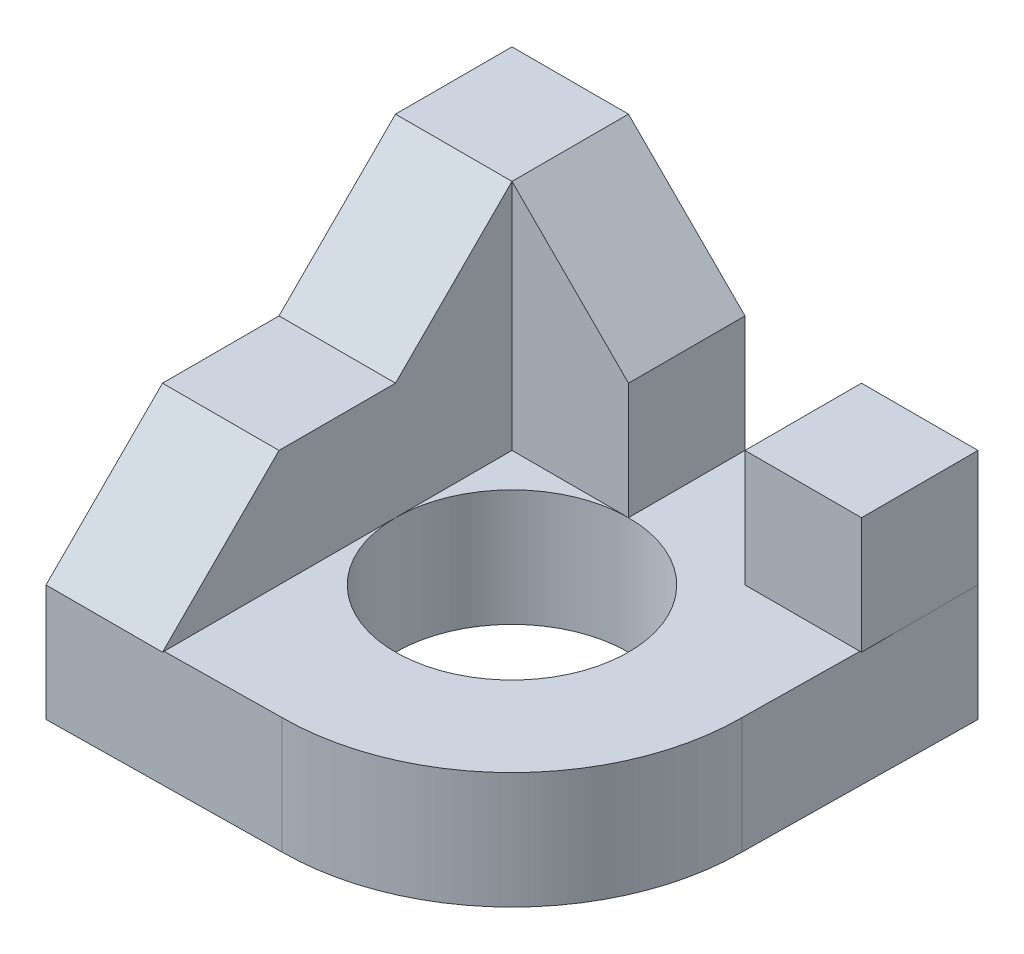
ISO-10303-21;
HEADER;
FILE_DESCRIPTION(('STEP AP214'),'2;1');
FILE_NAME('part.step','',(''),(''),'','','');
FILE_SCHEMA(('AUTOMOTIVE_DESIGN { 1 0 10303 214 1 1 1 1 }'));
ENDSEC;
DATA;
#1=APPLICATION_CONTEXT('core data for automotive mechanical design processes');
#2=APPLICATION_PROTOCOL_DEFINITION('international standard','automotive_design',2000,#1);
#3=PRODUCT_CONTEXT('',#1,'mechanical');
#4=PRODUCT('Part','Part','',(#3));
#5=PRODUCT_RELATED_PRODUCT_CATEGORY('part','',(#4));
#6=PRODUCT_DEFINITION_FORMATION('','',#4);
#7=PRODUCT_DEFINITION_CONTEXT('part definition',#1,'design');
#8=PRODUCT_DEFINITION('design','',#6,#7);
#9=PRODUCT_DEFINITION_SHAPE('','',#8);
#10=(LENGTH_UNIT() NAMED_UNIT(*) SI_UNIT(.MILLI.,.METRE.));
#11=(NAMED_UNIT(*) PLANE_ANGLE_UNIT() SI_UNIT($,.RADIAN.));
#12=(NAMED_UNIT(*) SI_UNIT($,.STERADIAN.) SOLID_ANGLE_UNIT());
#13=UNCERTAINTY_MEASURE_WITH_UNIT(LENGTH_MEASURE(1.E-05),#10,'distance_accuracy_value','');
#14=(GEOMETRIC_REPRESENTATION_CONTEXT(3) GLOBAL_UNCERTAINTY_ASSIGNED_CONTEXT((#13)) GLOBAL_UNIT_ASSIGNED_CONTEXT((#10,
#11,#12)) REPRESENTATION_CONTEXT('',''));
#15=CARTESIAN_POINT('',(0.,0.,0.));
#16=DIRECTION('',(0.,0.,1.));
#17=DIRECTION('',(1.,0.,0.));
#18=AXIS2_PLACEMENT_3D('',#15,#16,#17);
#19=CARTESIAN_POINT('',(-7.98479087452472,10.,-1.29277566539925));
#20=DIRECTION('',(0.,1.,0.));
#21=DIRECTION('',(0.,0.,1.));
#22=AXIS2_PLACEMENT_3D('',#19,#20,#21);
#23=PLANE('',#22);
#24=DIRECTION('',(0.,0.,-1.));
#25=VECTOR('',#24,1.);
#26=CARTESIAN_POINT('',(2.01520912547528,10.,-11.2927756653992));
#27=LINE('',#26,#25);
#28=CARTESIAN_POINT('',(2.01520912547528,10.,-11.2927756653992));
#29=VERTEX_POINT('',#28);
#30=CARTESIAN_POINT('',(2.01520912547528,10.,-21.2927756653992));
#31=VERTEX_POINT('',#30);
#32=EDGE_CURVE('E62',#29,#31,#27,.T.);
#33=ORIENTED_EDGE('',*,*,#32,.T.);
#34=DIRECTION('',(-1.,0.,0.));
#35=VECTOR('',#34,1.);
#36=CARTESIAN_POINT('',(-27.9847908745247,10.,-21.2927756653992));
#37=LINE('',#36,#35);
#38=CARTESIAN_POINT('',(-7.98479087452472,10.,-21.2927756653992));
#39=VERTEX_POINT('',#38);
#40=EDGE_CURVE('E301',#31,#39,#37,.T.);
#41=ORIENTED_EDGE('',*,*,#40,.T.);
#42=DIRECTION('',(0.,0.,-1.));
#43=VECTOR('',#42,1.);
#44=CARTESIAN_POINT('',(-7.98479087452472,10.,-11.2927756653992));
#45=LINE('',#44,#43);
#46=CARTESIAN_POINT('',(-7.98479087452472,10.,-11.2927756653992));
#47=VERTEX_POINT('',#46);
#48=EDGE_CURVE('E235',#47,#39,#45,.T.);
#49=ORIENTED_EDGE('',*,*,#48,.F.);
#50=CARTESIAN_POINT('',(-7.98479087452472,10.,-1.29277566539925));
#51=DIRECTION('',(0.,1.,0.));
#52=DIRECTION('',(0.,0.,1.));
#53=AXIS2_PLACEMENT_3D('',#50,#51,#52);
#54=CIRCLE('',#53,10.);
#55=CARTESIAN_POINT('',(-17.9847908745247,10.,-1.29277566539925));
#56=VERTEX_POINT('',#55);
#57=EDGE_CURVE('E292',#56,#47,#54,.T.);
#58=ORIENTED_EDGE('',*,*,#57,.F.);
#59=DIRECTION('',(0.,0.,1.));
#60=VECTOR('',#59,1.);
#61=CARTESIAN_POINT('',(-17.9847908745247,10.,-21.2927756653992));
#62=LINE('',#61,#60);
#63=CARTESIAN_POINT('',(-17.9847908745247,10.,18.5716349549008));
#64=VERTEX_POINT('',#63);
#65=EDGE_CURVE('E11',#56,#64,#62,.T.);
#66=ORIENTED_EDGE('',*,*,#65,.T.);
#67=DIRECTION('',(0.999908090273213,0.,-0.0135576917717117));
#68=VECTOR('',#67,1.);
#69=CARTESIAN_POINT('',(-27.9847908745247,10.,18.7072243346008));
#70=LINE('',#69,#68);
#71=CARTESIAN_POINT('',(-7.98479087452472,10.,18.4360455752008));
#72=VERTEX_POINT('',#71);
#73=EDGE_CURVE('E304',#64,#72,#70,.T.);
#74=ORIENTED_EDGE('',*,*,#73,.T.);
#75=CARTESIAN_POINT('',(-7.98479087452472,10.,-1.29277566539925));
#76=DIRECTION('',(0.,1.,0.));
#77=DIRECTION('',(0.,0.,1.));
#78=AXIS2_PLACEMENT_3D('',#75,#76,#77);
#79=CIRCLE('',#78,19.7288212406001);
#80=CARTESIAN_POINT('',(11.7440303660754,10.,-1.29277566539924));
#81=VERTEX_POINT('',#80);
#82=EDGE_CURVE('E310',#72,#81,#79,.T.);
#83=ORIENTED_EDGE('',*,*,#82,.T.);
#84=DIRECTION('',(0.0135576917717117,0.,-0.999908090273213));
#85=VECTOR('',#84,1.);
#86=CARTESIAN_POINT('',(12.0152091254753,10.,-21.2927756653992));
#87=LINE('',#86,#85);
#88=CARTESIAN_POINT('',(11.8796197457753,10.,-11.2927756653992));
#89=VERTEX_POINT('',#88);
#90=EDGE_CURVE('E313',#81,#89,#87,.T.);
#91=ORIENTED_EDGE('',*,*,#90,.T.);
#92=DIRECTION('',(-1.,0.,0.));
#93=VECTOR('',#92,1.);
#94=CARTESIAN_POINT('',(12.0152091254753,10.,-11.2927756653992));
#95=LINE('',#94,#93);
#96=EDGE_CURVE('E58',#89,#29,#95,.T.);
#97=ORIENTED_EDGE('',*,*,#96,.T.);
#98=EDGE_LOOP('',(#33,#41,#49,#58,#66,#74,#83,#91,#97));
#99=FACE_BOUND('',#98,.T.);
#100=ADVANCED_FACE('F39',(#99),#23,.T.);
#101=DIRECTION('',(-1.,0.,0.));
#102=VECTOR('',#101,1.);
#103=CARTESIAN_POINT('',(-17.9847908745247,10.,-11.2927756653992));
#104=LINE('',#103,#102);
#105=CARTESIAN_POINT('',(-17.9847908745247,10.,-11.2927756653992));
#106=VERTEX_POINT('',#105);
#107=EDGE_CURVE('E220',#47,#106,#104,.T.);
#108=ORIENTED_EDGE('',*,*,#107,.T.);
#109=EDGE_CURVE('E50',#106,#56,#62,.T.);
#110=ORIENTED_EDGE('',*,*,#109,.T.);
#111=EDGE_CURVE('E297',#47,#56,#54,.T.);
#112=ORIENTED_EDGE('',*,*,#111,.F.);
#113=EDGE_LOOP('',(#108,#110,#112));
#114=FACE_BOUND('',#113,.T.);
#115=ADVANCED_FACE('F405',(#114),#23,.T.);
#116=CARTESIAN_POINT('',(-7.98479087452472,0.,-1.29277566539925));
#117=DIRECTION('',(0.,1.,0.));
#118=DIRECTION('',(0.,0.,1.));
#119=AXIS2_PLACEMENT_3D('',#116,#117,#118);
#120=PLANE('',#119);
#121=DIRECTION('',(-1.,0.,0.));
#122=VECTOR('',#121,1.);
#123=CARTESIAN_POINT('',(-27.9847908745247,0.,-21.2927756653992));
#124=LINE('',#123,#122);
#125=CARTESIAN_POINT('',(12.0152091254753,0.,-21.2927756653992));
#126=VERTEX_POINT('',#125);
#127=CARTESIAN_POINT('',(-27.9847908745247,0.,-21.2927756653992));
#128=VERTEX_POINT('',#127);
#129=EDGE_CURVE('E296',#126,#128,#124,.T.);
#130=ORIENTED_EDGE('',*,*,#129,.F.);
#131=DIRECTION('',(0.0135576917717117,0.,-0.999908090273213));
#132=VECTOR('',#131,1.);
#133=CARTESIAN_POINT('',(12.0152091254753,0.,-21.2927756653992));
#134=LINE('',#133,#132);
#135=CARTESIAN_POINT('',(11.7440303660754,0.,-1.29277566539924));
#136=VERTEX_POINT('',#135);
#137=EDGE_CURVE('E305',#136,#126,#134,.T.);
#138=ORIENTED_EDGE('',*,*,#137,.F.);
#139=CARTESIAN_POINT('',(-7.98479087452472,0.,-1.29277566539925));
#140=DIRECTION('',(0.,1.,0.));
#141=DIRECTION('',(0.,0.,1.));
#142=AXIS2_PLACEMENT_3D('',#139,#140,#141);
#143=CIRCLE('',#142,19.7288212406001);
#144=CARTESIAN_POINT('',(-7.98479087452472,0.,18.4360455752008));
#145=VERTEX_POINT('',#144);
#146=EDGE_CURVE('E326',#145,#136,#143,.T.);
#147=ORIENTED_EDGE('',*,*,#146,.F.);
#148=DIRECTION('',(0.999908090273213,0.,-0.0135576917717117));
#149=VECTOR('',#148,1.);
#150=CARTESIAN_POINT('',(-27.9847908745247,0.,18.7072243346008));
#151=LINE('',#150,#149);
#152=CARTESIAN_POINT('',(-27.9847908745247,0.,18.7072243346008));
#153=VERTEX_POINT('',#152);
#154=EDGE_CURVE('E323',#153,#145,#151,.T.);
#155=ORIENTED_EDGE('',*,*,#154,.F.);
#156=DIRECTION('',(0.,0.,1.));
#157=VECTOR('',#156,1.);
#158=CARTESIAN_POINT('',(-27.9847908745247,0.,-21.2927756653992));
#159=LINE('',#158,#157);
#160=EDGE_CURVE('E320',#128,#153,#159,.T.);
#161=ORIENTED_EDGE('',*,*,#160,.F.);
#162=EDGE_LOOP('',(#130,#138,#147,#155,#161));
#163=FACE_BOUND('',#162,.T.);
#164=CARTESIAN_POINT('',(-7.98479087452472,0.,-1.29277566539925));
#165=DIRECTION('',(0.,1.,0.));
#166=DIRECTION('',(0.,0.,1.));
#167=AXIS2_PLACEMENT_3D('',#164,#165,#166);
#168=CIRCLE('',#167,10.);
#169=CARTESIAN_POINT('',(-7.98479087452472,0.,8.70722433460075));
#170=VERTEX_POINT('',#169);
#171=EDGE_CURVE('E279',#170,#170,#168,.T.);
#172=ORIENTED_EDGE('',*,*,#171,.T.);
#173=EDGE_LOOP('',(#172));
#174=FACE_BOUND('',#173,.T.);
#175=ADVANCED_FACE('F358',(#163,#174),#120,.F.);
#176=CARTESIAN_POINT('',(-27.9847908745247,10.,-21.2927756653992));
#177=DIRECTION('',(0.,0.,1.));
#178=DIRECTION('',(1.,0.,0.));
#179=AXIS2_PLACEMENT_3D('',#176,#177,#178);
#180=PLANE('',#179);
#181=ORIENTED_EDGE('',*,*,#129,.T.);
#182=DIRECTION('',(0.,-1.,0.));
#183=VECTOR('',#182,1.);
#184=CARTESIAN_POINT('',(-27.9847908745247,10.,-21.2927756653992));
#185=LINE('',#184,#183);
#186=CARTESIAN_POINT('',(-27.9847908745247,30.,-21.2927756653992));
#187=VERTEX_POINT('',#186);
#188=EDGE_CURVE('E43',#187,#128,#185,.T.);
#189=ORIENTED_EDGE('',*,*,#188,.F.);
#190=DIRECTION('',(-1.,0.,0.));
#191=VECTOR('',#190,1.);
#192=CARTESIAN_POINT('',(-17.9847908745247,30.,-21.2927756653992));
#193=LINE('',#192,#191);
#194=CARTESIAN_POINT('',(-17.9847908745247,30.,-21.2927756653992));
#195=VERTEX_POINT('',#194);
#196=EDGE_CURVE('E283',#195,#187,#193,.T.);
#197=ORIENTED_EDGE('',*,*,#196,.F.);
#198=DIRECTION('',(0.707106781186547,-0.707106781186548,0.));
#199=VECTOR('',#198,1.);
#200=CARTESIAN_POINT('',(-7.98479087452472,20.,-21.2927756653992));
#201=LINE('',#200,#199);
#202=CARTESIAN_POINT('',(-7.98479087452472,20.,-21.2927756653992));
#203=VERTEX_POINT('',#202);
#204=EDGE_CURVE('E205',#195,#203,#201,.T.);
#205=ORIENTED_EDGE('',*,*,#204,.T.);
#206=DIRECTION('',(0.,-1.,0.));
#207=VECTOR('',#206,1.);
#208=CARTESIAN_POINT('',(-7.98479087452472,10.,-21.2927756653992));
#209=LINE('',#208,#207);
#210=EDGE_CURVE('E216',#203,#39,#209,.T.);
#211=ORIENTED_EDGE('',*,*,#210,.T.);
#212=ORIENTED_EDGE('',*,*,#40,.F.);
#213=DIRECTION('',(0.,1.,0.));
#214=VECTOR('',#213,1.);
#215=CARTESIAN_POINT('',(2.01520912547528,10.,-21.2927756653992));
#216=LINE('',#215,#214);
#217=CARTESIAN_POINT('',(2.01520912547528,20.,-21.2927756653992));
#218=VERTEX_POINT('',#217);
#219=EDGE_CURVE('E189',#31,#218,#216,.T.);
#220=ORIENTED_EDGE('',*,*,#219,.T.);
#221=DIRECTION('',(1.,0.,0.));
#222=VECTOR('',#221,1.);
#223=CARTESIAN_POINT('',(12.0152091254753,20.,-21.2927756653992));
#224=LINE('',#223,#222);
#225=CARTESIAN_POINT('',(12.0152091254753,20.,-21.2927756653992));
#226=VERTEX_POINT('',#225);
#227=EDGE_CURVE('E184',#218,#226,#224,.T.);
#228=ORIENTED_EDGE('',*,*,#227,.T.);
#229=DIRECTION('',(0.,-1.,0.));
#230=VECTOR('',#229,1.);
#231=CARTESIAN_POINT('',(12.0152091254753,10.,-21.2927756653992));
#232=LINE('',#231,#230);
#233=CARTESIAN_POINT('',(12.0152091254753,10.,-21.2927756653992));
#234=VERTEX_POINT('',#233);
#235=EDGE_CURVE('E197',#226,#234,#232,.T.);
#236=ORIENTED_EDGE('',*,*,#235,.T.);
#237=DIRECTION('',(0.,-1.,0.));
#238=VECTOR('',#237,1.);
#239=CARTESIAN_POINT('',(12.0152091254753,10.,-21.2927756653992));
#240=LINE('',#239,#238);
#241=EDGE_CURVE('E316',#234,#126,#240,.T.);
#242=ORIENTED_EDGE('',*,*,#241,.T.);
#243=EDGE_LOOP('',(#181,#189,#197,#205,#211,#212,#220,#228,#236,#242));
#244=FACE_BOUND('',#243,.T.);
#245=ADVANCED_FACE('F41',(#244),#180,.F.);
#246=CARTESIAN_POINT('',(-27.9847908745247,10.,-21.2927756653992));
#247=DIRECTION('',(1.,0.,0.));
#248=DIRECTION('',(0.,0.,-1.));
#249=AXIS2_PLACEMENT_3D('',#246,#247,#248);
#250=PLANE('',#249);
#251=ORIENTED_EDGE('',*,*,#160,.T.);
#252=DIRECTION('',(0.,-1.,0.));
#253=VECTOR('',#252,1.);
#254=CARTESIAN_POINT('',(-27.9847908745247,10.,18.7072243346008));
#255=LINE('',#254,#253);
#256=CARTESIAN_POINT('',(-27.9847908745247,10.,18.7072243346008));
#257=VERTEX_POINT('',#256);
#258=EDGE_CURVE('E341',#257,#153,#255,.T.);
#259=ORIENTED_EDGE('',*,*,#258,.F.);
#260=DIRECTION('',(0.,0.707106781186548,-0.707106781186547));
#261=VECTOR('',#260,1.);
#262=CARTESIAN_POINT('',(-27.9847908745247,10.,18.7072243346008));
#263=LINE('',#262,#261);
#264=CARTESIAN_POINT('',(-27.9847908745247,20.,8.70722433460075));
#265=VERTEX_POINT('',#264);
#266=EDGE_CURVE('E247',#257,#265,#263,.T.);
#267=ORIENTED_EDGE('',*,*,#266,.T.);
#268=DIRECTION('',(0.,0.,-1.));
#269=VECTOR('',#268,1.);
#270=CARTESIAN_POINT('',(-27.9847908745247,20.,8.70722433460075));
#271=LINE('',#270,#269);
#272=CARTESIAN_POINT('',(-27.9847908745247,20.,-1.29277566539925));
#273=VERTEX_POINT('',#272);
#274=EDGE_CURVE('E239',#265,#273,#271,.T.);
#275=ORIENTED_EDGE('',*,*,#274,.T.);
#276=DIRECTION('',(0.,0.707106781186547,-0.707106781186548));
#277=VECTOR('',#276,1.);
#278=CARTESIAN_POINT('',(-27.9847908745247,20.,-1.29277566539925));
#279=LINE('',#278,#277);
#280=CARTESIAN_POINT('',(-27.9847908745247,30.,-11.2927756653992));
#281=VERTEX_POINT('',#280);
#282=EDGE_CURVE('E265',#273,#281,#279,.T.);
#283=ORIENTED_EDGE('',*,*,#282,.T.);
#284=DIRECTION('',(0.,0.,-1.));
#285=VECTOR('',#284,1.);
#286=CARTESIAN_POINT('',(-27.9847908745247,30.,-11.2927756653992));
#287=LINE('',#286,#285);
#288=EDGE_CURVE('E269',#281,#187,#287,.T.);
#289=ORIENTED_EDGE('',*,*,#288,.T.);
#290=ORIENTED_EDGE('',*,*,#188,.T.);
#291=EDGE_LOOP('',(#251,#259,#267,#275,#283,#289,#290));
#292=FACE_BOUND('',#291,.T.);
#293=ADVANCED_FACE('F351',(#292),#250,.F.);
#294=CARTESIAN_POINT('',(-27.9847908745247,10.,18.7072243346008));
#295=DIRECTION('',(-0.0135576917717117,0.,-0.999908090273213));
#296=DIRECTION('',(-0.999908090273213,0.,0.0135576917717117));
#297=AXIS2_PLACEMENT_3D('',#294,#295,#296);
#298=PLANE('',#297);
#299=ORIENTED_EDGE('',*,*,#154,.T.);
#300=DIRECTION('',(0.,-1.,0.));
#301=VECTOR('',#300,1.);
#302=CARTESIAN_POINT('',(-7.98479087452472,10.,18.4360455752008));
#303=LINE('',#302,#301);
#304=EDGE_CURVE('E338',#72,#145,#303,.T.);
#305=ORIENTED_EDGE('',*,*,#304,.F.);
#306=ORIENTED_EDGE('',*,*,#73,.F.);
#307=EDGE_CURVE('E306',#257,#64,#70,.T.);
#308=ORIENTED_EDGE('',*,*,#307,.F.);
#309=ORIENTED_EDGE('',*,*,#258,.T.);
#310=EDGE_LOOP('',(#299,#305,#306,#308,#309));
#311=FACE_BOUND('',#310,.T.);
#312=ADVANCED_FACE('F362',(#311),#298,.F.);
#313=CARTESIAN_POINT('',(-7.98479087452472,10.,-1.29277566539925));
#314=DIRECTION('',(0.,-1.,0.));
#315=DIRECTION('',(0.,0.,-1.));
#316=AXIS2_PLACEMENT_3D('',#313,#314,#315);
#317=CYLINDRICAL_SURFACE('',#316,19.7288212406001);
#318=ORIENTED_EDGE('',*,*,#146,.T.);
#319=DIRECTION('',(0.,-1.,0.));
#320=VECTOR('',#319,1.);
#321=CARTESIAN_POINT('',(11.7440303660754,10.,-1.29277566539924));
#322=LINE('',#321,#320);
#323=EDGE_CURVE('E334',#81,#136,#322,.T.);
#324=ORIENTED_EDGE('',*,*,#323,.F.);
#325=ORIENTED_EDGE('',*,*,#82,.F.);
#326=ORIENTED_EDGE('',*,*,#304,.T.);
#327=EDGE_LOOP('',(#318,#324,#325,#326));
#328=FACE_BOUND('',#327,.T.);
#329=ADVANCED_FACE('F366',(#328),#317,.T.);
#330=CARTESIAN_POINT('',(12.0152091254753,10.,-21.2927756653992));
#331=DIRECTION('',(-0.999908090273213,0.,-0.0135576917717117));
#332=DIRECTION('',(-0.0135576917717117,0.,0.999908090273213));
#333=AXIS2_PLACEMENT_3D('',#330,#331,#332);
#334=PLANE('',#333);
#335=ORIENTED_EDGE('',*,*,#137,.T.);
#336=ORIENTED_EDGE('',*,*,#241,.F.);
#337=EDGE_CURVE('E163',#89,#234,#87,.T.);
#338=ORIENTED_EDGE('',*,*,#337,.F.);
#339=ORIENTED_EDGE('',*,*,#90,.F.);
#340=ORIENTED_EDGE('',*,*,#323,.T.);
#341=EDGE_LOOP('',(#335,#336,#338,#339,#340));
#342=FACE_BOUND('',#341,.T.);
#343=ADVANCED_FACE('F410',(#342),#334,.F.);
#344=CARTESIAN_POINT('',(-7.98479087452472,10.,-1.29277566539925));
#345=DIRECTION('',(0.,-1.,0.));
#346=DIRECTION('',(0.,0.,-1.));
#347=AXIS2_PLACEMENT_3D('',#344,#345,#346);
#348=CYLINDRICAL_SURFACE('',#347,10.);
#349=ORIENTED_EDGE('',*,*,#57,.T.);
#350=ORIENTED_EDGE('',*,*,#111,.T.);
#351=EDGE_LOOP('',(#349,#350));
#352=FACE_BOUND('',#351,.T.);
#353=ORIENTED_EDGE('',*,*,#171,.F.);
#354=EDGE_LOOP('',(#353));
#355=FACE_BOUND('',#354,.T.);
#356=ADVANCED_FACE('F407',(#352,#355),#348,.F.);
#357=CARTESIAN_POINT('',(-17.9847908745247,20.,8.70722433460075));
#358=DIRECTION('',(0.,1.,0.));
#359=DIRECTION('',(0.,0.,1.));
#360=AXIS2_PLACEMENT_3D('',#357,#358,#359);
#361=PLANE('',#360);
#362=ORIENTED_EDGE('',*,*,#274,.F.);
#363=DIRECTION('',(-1.,0.,0.));
#364=VECTOR('',#363,1.);
#365=CARTESIAN_POINT('',(-17.9847908745247,20.,8.70722433460075));
#366=LINE('',#365,#364);
#367=CARTESIAN_POINT('',(-17.9847908745247,20.,8.70722433460075));
#368=VERTEX_POINT('',#367);
#369=EDGE_CURVE('E276',#368,#265,#366,.T.);
#370=ORIENTED_EDGE('',*,*,#369,.F.);
#371=DIRECTION('',(0.,0.,-1.));
#372=VECTOR('',#371,1.);
#373=CARTESIAN_POINT('',(-17.9847908745247,20.,8.70722433460075));
#374=LINE('',#373,#372);
#375=CARTESIAN_POINT('',(-17.9847908745247,20.,-1.29277566539925));
#376=VERTEX_POINT('',#375);
#377=EDGE_CURVE('E242',#368,#376,#374,.T.);
#378=ORIENTED_EDGE('',*,*,#377,.T.);
#379=DIRECTION('',(-1.,0.,0.));
#380=VECTOR('',#379,1.);
#381=CARTESIAN_POINT('',(-17.9847908745247,20.,-1.29277566539925));
#382=LINE('',#381,#380);
#383=EDGE_CURVE('E261',#376,#273,#382,.T.);
#384=ORIENTED_EDGE('',*,*,#383,.T.);
#385=EDGE_LOOP('',(#362,#370,#378,#384));
#386=FACE_BOUND('',#385,.T.);
#387=ADVANCED_FACE('F388',(#386),#361,.T.);
#388=CARTESIAN_POINT('',(-17.9847908745247,10.,18.7072243346008));
#389=DIRECTION('',(0.,0.707106781186547,0.707106781186548));
#390=DIRECTION('',(0.,-0.707106781186548,0.707106781186547));
#391=AXIS2_PLACEMENT_3D('',#388,#389,#390);
#392=PLANE('',#391);
#393=ORIENTED_EDGE('',*,*,#266,.F.);
#394=DIRECTION('',(-1.,0.,0.));
#395=VECTOR('',#394,1.);
#396=CARTESIAN_POINT('',(-17.9847908745247,10.,18.7072243346008));
#397=LINE('',#396,#395);
#398=CARTESIAN_POINT('',(-17.9847908745247,10.,18.7072243346008));
#399=VERTEX_POINT('',#398);
#400=EDGE_CURVE('E280',#399,#257,#397,.T.);
#401=ORIENTED_EDGE('',*,*,#400,.F.);
#402=DIRECTION('',(0.,0.707106781186548,-0.707106781186547));
#403=VECTOR('',#402,1.);
#404=CARTESIAN_POINT('',(-17.9847908745247,10.,18.7072243346008));
#405=LINE('',#404,#403);
#406=EDGE_CURVE('E257',#399,#368,#405,.T.);
#407=ORIENTED_EDGE('',*,*,#406,.T.);
#408=ORIENTED_EDGE('',*,*,#369,.T.);
#409=EDGE_LOOP('',(#393,#401,#407,#408));
#410=FACE_BOUND('',#409,.T.);
#411=ADVANCED_FACE('F381',(#410),#392,.T.);
#412=CARTESIAN_POINT('',(-17.9847908745247,10.,-21.2927756653992));
#413=DIRECTION('',(0.,-1.,0.));
#414=DIRECTION('',(0.,0.,-1.));
#415=AXIS2_PLACEMENT_3D('',#412,#413,#414);
#416=PLANE('',#415);
#417=ORIENTED_EDGE('',*,*,#400,.T.);
#418=ORIENTED_EDGE('',*,*,#307,.T.);
#419=EDGE_CURVE('E51',#64,#399,#62,.T.);
#420=ORIENTED_EDGE('',*,*,#419,.T.);
#421=EDGE_LOOP('',(#417,#418,#420));
#422=FACE_BOUND('',#421,.T.);
#423=ADVANCED_FACE('F376',(#422),#416,.T.);
#424=CARTESIAN_POINT('',(-17.9847908745247,30.,-11.2927756653992));
#425=DIRECTION('',(0.,1.,0.));
#426=DIRECTION('',(0.,0.,1.));
#427=AXIS2_PLACEMENT_3D('',#424,#425,#426);
#428=PLANE('',#427);
#429=ORIENTED_EDGE('',*,*,#288,.F.);
#430=DIRECTION('',(-1.,0.,0.));
#431=VECTOR('',#430,1.);
#432=CARTESIAN_POINT('',(-17.9847908745247,30.,-11.2927756653992));
#433=LINE('',#432,#431);
#434=CARTESIAN_POINT('',(-17.9847908745247,30.,-11.2927756653992));
#435=VERTEX_POINT('',#434);
#436=EDGE_CURVE('E287',#435,#281,#433,.T.);
#437=ORIENTED_EDGE('',*,*,#436,.F.);
#438=DIRECTION('',(0.,0.,-1.));
#439=VECTOR('',#438,1.);
#440=CARTESIAN_POINT('',(-17.9847908745247,30.,-11.2927756653992));
#441=LINE('',#440,#439);
#442=EDGE_CURVE('E251',#435,#195,#441,.T.);
#443=ORIENTED_EDGE('',*,*,#442,.T.);
#444=ORIENTED_EDGE('',*,*,#196,.T.);
#445=EDGE_LOOP('',(#429,#437,#443,#444));
#446=FACE_BOUND('',#445,.T.);
#447=ADVANCED_FACE('F394',(#446),#428,.T.);
#448=CARTESIAN_POINT('',(-17.9847908745247,20.,-1.29277566539925));
#449=DIRECTION('',(0.,0.707106781186548,0.707106781186547));
#450=DIRECTION('',(0.,-0.707106781186547,0.707106781186548));
#451=AXIS2_PLACEMENT_3D('',#448,#449,#450);
#452=PLANE('',#451);
#453=ORIENTED_EDGE('',*,*,#282,.F.);
#454=ORIENTED_EDGE('',*,*,#383,.F.);
#455=DIRECTION('',(0.,0.707106781186547,-0.707106781186548));
#456=VECTOR('',#455,1.);
#457=CARTESIAN_POINT('',(-17.9847908745247,20.,-1.29277566539925));
#458=LINE('',#457,#456);
#459=EDGE_CURVE('E246',#376,#435,#458,.T.);
#460=ORIENTED_EDGE('',*,*,#459,.T.);
#461=ORIENTED_EDGE('',*,*,#436,.T.);
#462=EDGE_LOOP('',(#453,#454,#460,#461));
#463=FACE_BOUND('',#462,.T.);
#464=ADVANCED_FACE('F391',(#463),#452,.T.);
#465=CARTESIAN_POINT('',(-17.9847908745247,0.,0.));
#466=DIRECTION('',(-1.,0.,0.));
#467=DIRECTION('',(0.,0.,1.));
#468=AXIS2_PLACEMENT_3D('',#465,#466,#467);
#469=PLANE('',#468);
#470=ORIENTED_EDGE('',*,*,#109,.F.);
#471=DIRECTION('',(0.,1.,0.));
#472=VECTOR('',#471,1.);
#473=CARTESIAN_POINT('',(-17.9847908745247,30.,-11.2927756653992));
#474=LINE('',#473,#472);
#475=EDGE_CURVE('E224',#106,#435,#474,.T.);
#476=ORIENTED_EDGE('',*,*,#475,.T.);
#477=ORIENTED_EDGE('',*,*,#459,.F.);
#478=ORIENTED_EDGE('',*,*,#377,.F.);
#479=ORIENTED_EDGE('',*,*,#406,.F.);
#480=ORIENTED_EDGE('',*,*,#419,.F.);
#481=ORIENTED_EDGE('',*,*,#65,.F.);
#482=EDGE_LOOP('',(#470,#476,#477,#478,#479,#480,#481));
#483=FACE_BOUND('',#482,.T.);
#484=ADVANCED_FACE('F384',(#483),#469,.F.);
#485=CARTESIAN_POINT('',(-7.98479087452472,20.,-11.2927756653992));
#486=DIRECTION('',(0.707106781186548,0.707106781186547,0.));
#487=DIRECTION('',(-0.707106781186547,0.707106781186548,0.));
#488=AXIS2_PLACEMENT_3D('',#485,#486,#487);
#489=PLANE('',#488);
#490=ORIENTED_EDGE('',*,*,#204,.F.);
#491=ORIENTED_EDGE('',*,*,#442,.F.);
#492=DIRECTION('',(0.707106781186547,-0.707106781186548,0.));
#493=VECTOR('',#492,1.);
#494=CARTESIAN_POINT('',(-7.98479087452472,20.,-11.2927756653992));
#495=LINE('',#494,#493);
#496=CARTESIAN_POINT('',(-7.98479087452472,20.,-11.2927756653992));
#497=VERTEX_POINT('',#496);
#498=EDGE_CURVE('E211',#435,#497,#495,.T.);
#499=ORIENTED_EDGE('',*,*,#498,.T.);
#500=DIRECTION('',(0.,0.,-1.));
#501=VECTOR('',#500,1.);
#502=CARTESIAN_POINT('',(-7.98479087452472,20.,-11.2927756653992));
#503=LINE('',#502,#501);
#504=EDGE_CURVE('E228',#497,#203,#503,.T.);
#505=ORIENTED_EDGE('',*,*,#504,.T.);
#506=EDGE_LOOP('',(#490,#491,#499,#505));
#507=FACE_BOUND('',#506,.T.);
#508=ADVANCED_FACE('F397',(#507),#489,.T.);
#509=CARTESIAN_POINT('',(-7.98479087452472,10.,-11.2927756653992));
#510=DIRECTION('',(1.,0.,0.));
#511=DIRECTION('',(0.,0.,-1.));
#512=AXIS2_PLACEMENT_3D('',#509,#510,#511);
#513=PLANE('',#512);
#514=ORIENTED_EDGE('',*,*,#210,.F.);
#515=ORIENTED_EDGE('',*,*,#504,.F.);
#516=DIRECTION('',(0.,-1.,0.));
#517=VECTOR('',#516,1.);
#518=CARTESIAN_POINT('',(-7.98479087452472,10.,-11.2927756653992));
#519=LINE('',#518,#517);
#520=EDGE_CURVE('E215',#497,#47,#519,.T.);
#521=ORIENTED_EDGE('',*,*,#520,.T.);
#522=ORIENTED_EDGE('',*,*,#48,.T.);
#523=EDGE_LOOP('',(#514,#515,#521,#522));
#524=FACE_BOUND('',#523,.T.);
#525=ADVANCED_FACE('F401',(#524),#513,.T.);
#526=CARTESIAN_POINT('',(0.,0.,-11.2927756653992));
#527=DIRECTION('',(0.,0.,1.));
#528=DIRECTION('',(1.,0.,0.));
#529=AXIS2_PLACEMENT_3D('',#526,#527,#528);
#530=PLANE('',#529);
#531=ORIENTED_EDGE('',*,*,#498,.F.);
#532=ORIENTED_EDGE('',*,*,#475,.F.);
#533=ORIENTED_EDGE('',*,*,#107,.F.);
#534=ORIENTED_EDGE('',*,*,#520,.F.);
#535=EDGE_LOOP('',(#531,#532,#533,#534));
#536=FACE_BOUND('',#535,.T.);
#537=ADVANCED_FACE('F441',(#536),#530,.T.);
#538=CARTESIAN_POINT('',(12.0152091254753,10.,-11.2927756653992));
#539=DIRECTION('',(0.,-1.,0.));
#540=DIRECTION('',(0.,0.,-1.));
#541=AXIS2_PLACEMENT_3D('',#538,#539,#540);
#542=PLANE('',#541);
#543=ORIENTED_EDGE('',*,*,#337,.T.);
#544=DIRECTION('',(0.,0.,-1.));
#545=VECTOR('',#544,1.);
#546=CARTESIAN_POINT('',(12.0152091254753,10.,-11.2927756653992));
#547=LINE('',#546,#545);
#548=CARTESIAN_POINT('',(12.0152091254753,10.,-11.2927756653992));
#549=VERTEX_POINT('',#548);
#550=EDGE_CURVE('E159',#549,#234,#547,.T.);
#551=ORIENTED_EDGE('',*,*,#550,.F.);
#552=EDGE_CURVE('E162',#549,#89,#95,.T.);
#553=ORIENTED_EDGE('',*,*,#552,.T.);
#554=EDGE_LOOP('',(#543,#551,#553));
#555=FACE_BOUND('',#554,.T.);
#556=ADVANCED_FACE('F161',(#555),#542,.T.);
#557=CARTESIAN_POINT('',(12.0152091254753,10.,-11.2927756653992));
#558=DIRECTION('',(1.,0.,0.));
#559=DIRECTION('',(0.,0.,-1.));
#560=AXIS2_PLACEMENT_3D('',#557,#558,#559);
#561=PLANE('',#560);
#562=ORIENTED_EDGE('',*,*,#235,.F.);
#563=DIRECTION('',(0.,0.,-1.));
#564=VECTOR('',#563,1.);
#565=CARTESIAN_POINT('',(12.0152091254753,20.,-11.2927756653992));
#566=LINE('',#565,#564);
#567=CARTESIAN_POINT('',(12.0152091254753,20.,-11.2927756653992));
#568=VERTEX_POINT('',#567);
#569=EDGE_CURVE('E182',#568,#226,#566,.T.);
#570=ORIENTED_EDGE('',*,*,#569,.F.);
#571=DIRECTION('',(0.,-1.,0.));
#572=VECTOR('',#571,1.);
#573=CARTESIAN_POINT('',(12.0152091254753,10.,-11.2927756653992));
#574=LINE('',#573,#572);
#575=EDGE_CURVE('E175',#568,#549,#574,.T.);
#576=ORIENTED_EDGE('',*,*,#575,.T.);
#577=ORIENTED_EDGE('',*,*,#550,.T.);
#578=EDGE_LOOP('',(#562,#570,#576,#577));
#579=FACE_BOUND('',#578,.T.);
#580=ADVANCED_FACE('F181',(#579),#561,.T.);
#581=CARTESIAN_POINT('',(12.0152091254753,20.,-11.2927756653992));
#582=DIRECTION('',(0.,1.,0.));
#583=DIRECTION('',(0.,0.,1.));
#584=AXIS2_PLACEMENT_3D('',#581,#582,#583);
#585=PLANE('',#584);
#586=ORIENTED_EDGE('',*,*,#227,.F.);
#587=DIRECTION('',(0.,0.,-1.));
#588=VECTOR('',#587,1.);
#589=CARTESIAN_POINT('',(2.01520912547528,20.,-11.2927756653992));
#590=LINE('',#589,#588);
#591=CARTESIAN_POINT('',(2.01520912547528,20.,-11.2927756653992));
#592=VERTEX_POINT('',#591);
#593=EDGE_CURVE('E206',#592,#218,#590,.T.);
#594=ORIENTED_EDGE('',*,*,#593,.F.);
#595=DIRECTION('',(1.,0.,0.));
#596=VECTOR('',#595,1.);
#597=CARTESIAN_POINT('',(12.0152091254753,20.,-11.2927756653992));
#598=LINE('',#597,#596);
#599=EDGE_CURVE('E169',#592,#568,#598,.T.);
#600=ORIENTED_EDGE('',*,*,#599,.T.);
#601=ORIENTED_EDGE('',*,*,#569,.T.);
#602=EDGE_LOOP('',(#586,#594,#600,#601));
#603=FACE_BOUND('',#602,.T.);
#604=ADVANCED_FACE('F447',(#603),#585,.T.);
#605=CARTESIAN_POINT('',(2.01520912547528,10.,-11.2927756653992));
#606=DIRECTION('',(-1.,0.,0.));
#607=DIRECTION('',(0.,0.,1.));
#608=AXIS2_PLACEMENT_3D('',#605,#606,#607);
#609=PLANE('',#608);
#610=ORIENTED_EDGE('',*,*,#219,.F.);
#611=ORIENTED_EDGE('',*,*,#32,.F.);
#612=DIRECTION('',(0.,1.,0.));
#613=VECTOR('',#612,1.);
#614=CARTESIAN_POINT('',(2.01520912547528,10.,-11.2927756653992));
#615=LINE('',#614,#613);
#616=EDGE_CURVE('E179',#29,#592,#615,.T.);
#617=ORIENTED_EDGE('',*,*,#616,.T.);
#618=ORIENTED_EDGE('',*,*,#593,.T.);
#619=EDGE_LOOP('',(#610,#611,#617,#618));
#620=FACE_BOUND('',#619,.T.);
#621=ADVANCED_FACE('F450',(#620),#609,.T.);
#622=CARTESIAN_POINT('',(0.,0.,-11.2927756653992));
#623=DIRECTION('',(0.,0.,1.));
#624=DIRECTION('',(1.,0.,0.));
#625=AXIS2_PLACEMENT_3D('',#622,#623,#624);
#626=PLANE('',#625);
#627=ORIENTED_EDGE('',*,*,#575,.F.);
#628=ORIENTED_EDGE('',*,*,#599,.F.);
#629=ORIENTED_EDGE('',*,*,#616,.F.);
#630=ORIENTED_EDGE('',*,*,#96,.F.);
#631=ORIENTED_EDGE('',*,*,#552,.F.);
#632=EDGE_LOOP('',(#627,#628,#629,#630,#631));
#633=FACE_BOUND('',#632,.T.);
#634=ADVANCED_FACE('F173',(#633),#626,.T.);
#635=CLOSED_SHELL('',(#100,#115,#175,#245,#293,#312,#329,#343,#356,#387,#411,#423,#447,#464,
#484,#508,#525,#537,#556,#580,#604,#621,#634));
#636=MANIFOLD_SOLID_BREP('B2',#635);
#637=ADVANCED_BREP_SHAPE_REPRESENTATION('',(#18,#636),#14);
#638=SHAPE_DEFINITION_REPRESENTATION(#9,#637);
ENDSEC;
END-ISO-10303-21;
